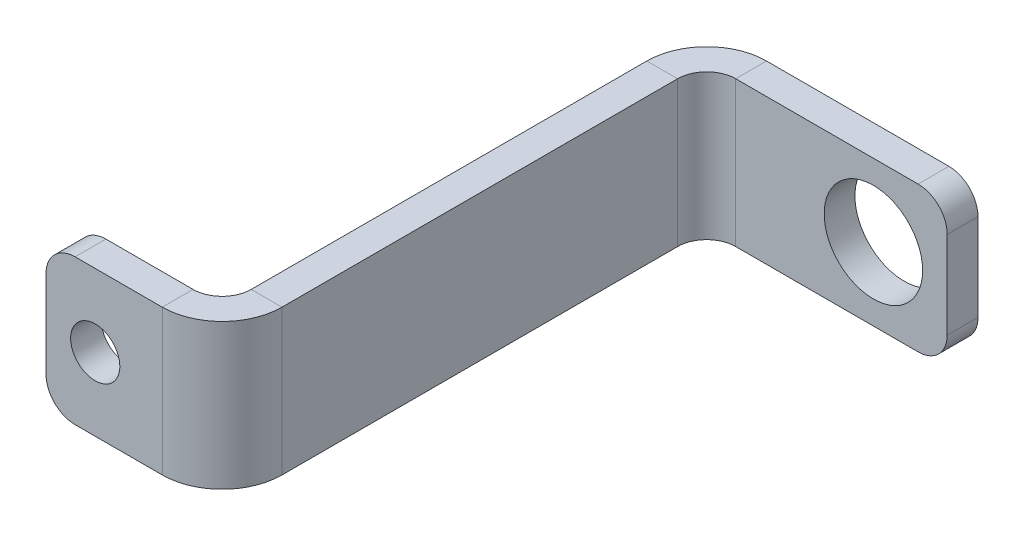
ISO-10303-21;
HEADER;
FILE_DESCRIPTION(('STEP AP214'),'2;1');
FILE_NAME('part.step','',(''),(''),'','','');
FILE_SCHEMA(('AUTOMOTIVE_DESIGN { 1 0 10303 214 1 1 1 1 }'));
ENDSEC;
DATA;
#1=APPLICATION_CONTEXT('core data for automotive mechanical design processes');
#2=APPLICATION_PROTOCOL_DEFINITION('international standard','automotive_design',2000,#1);
#3=PRODUCT_CONTEXT('',#1,'mechanical');
#4=PRODUCT('Part','Part','',(#3));
#5=PRODUCT_RELATED_PRODUCT_CATEGORY('part','',(#4));
#6=PRODUCT_DEFINITION_FORMATION('','',#4);
#7=PRODUCT_DEFINITION_CONTEXT('part definition',#1,'design');
#8=PRODUCT_DEFINITION('design','',#6,#7);
#9=PRODUCT_DEFINITION_SHAPE('','',#8);
#10=(LENGTH_UNIT() NAMED_UNIT(*) SI_UNIT(.MILLI.,.METRE.));
#11=(NAMED_UNIT(*) PLANE_ANGLE_UNIT() SI_UNIT($,.RADIAN.));
#12=(NAMED_UNIT(*) SI_UNIT($,.STERADIAN.) SOLID_ANGLE_UNIT());
#13=UNCERTAINTY_MEASURE_WITH_UNIT(LENGTH_MEASURE(1.E-05),#10,'distance_accuracy_value','');
#14=(GEOMETRIC_REPRESENTATION_CONTEXT(3) GLOBAL_UNCERTAINTY_ASSIGNED_CONTEXT((#13)) GLOBAL_UNIT_ASSIGNED_CONTEXT((#10,
#11,#12)) REPRESENTATION_CONTEXT('',''));
#15=CARTESIAN_POINT('',(0.,0.,0.));
#16=DIRECTION('',(0.,0.,1.));
#17=DIRECTION('',(1.,0.,0.));
#18=AXIS2_PLACEMENT_3D('',#15,#16,#17);
#19=CARTESIAN_POINT('',(10.6750000000002,7.5,-50.));
#20=DIRECTION('',(0.,1.,0.));
#21=DIRECTION('',(0.,0.,1.));
#22=AXIS2_PLACEMENT_3D('',#19,#20,#21);
#23=PLANE('',#22);
#24=DIRECTION('',(0.,0.,-1.));
#25=VECTOR('',#24,1.);
#26=CARTESIAN_POINT('',(10.6750000000002,7.5,-50.));
#27=LINE('',#26,#25);
#28=CARTESIAN_POINT('',(10.675,7.5,-6.17499999999998));
#29=VERTEX_POINT('',#28);
#30=CARTESIAN_POINT('',(10.6750000000001,7.5,-47.));
#31=VERTEX_POINT('',#30);
#32=EDGE_CURVE('E238',#29,#31,#27,.T.);
#33=ORIENTED_EDGE('',*,*,#32,.T.);
#34=DIRECTION('',(-1.,0.,0.));
#35=VECTOR('',#34,1.);
#36=CARTESIAN_POINT('',(10.6750000000001,7.5,-47.));
#37=LINE('',#36,#35);
#38=CARTESIAN_POINT('',(7.50000000000015,7.5,-47.));
#39=VERTEX_POINT('',#38);
#40=EDGE_CURVE('E213',#31,#39,#37,.T.);
#41=ORIENTED_EDGE('',*,*,#40,.T.);
#42=DIRECTION('',(0.,0.,-1.));
#43=VECTOR('',#42,1.);
#44=CARTESIAN_POINT('',(7.50000000000016,7.5,-50.));
#45=LINE('',#44,#43);
#46=CARTESIAN_POINT('',(7.50000000000001,7.5,-6.17499999999999));
#47=VERTEX_POINT('',#46);
#48=EDGE_CURVE('E237',#47,#39,#45,.T.);
#49=ORIENTED_EDGE('',*,*,#48,.F.);
#50=DIRECTION('',(1.,0.,0.));
#51=VECTOR('',#50,1.);
#52=CARTESIAN_POINT('',(7.50000000000001,7.5,-6.17499999999999));
#53=LINE('',#52,#51);
#54=EDGE_CURVE('E224',#47,#29,#53,.T.);
#55=ORIENTED_EDGE('',*,*,#54,.T.);
#56=EDGE_LOOP('',(#33,#41,#49,#55));
#57=FACE_BOUND('',#56,.T.);
#58=ADVANCED_FACE('F43',(#57),#23,.T.);
#59=CARTESIAN_POINT('',(10.675,0.,0.));
#60=DIRECTION('',(1.,0.,0.));
#61=DIRECTION('',(0.,0.,-1.));
#62=AXIS2_PLACEMENT_3D('',#59,#60,#61);
#63=PLANE('',#62);
#64=DIRECTION('',(0.,0.,1.));
#65=VECTOR('',#64,1.);
#66=CARTESIAN_POINT('',(10.675,-7.5,-3.17499999999999));
#67=LINE('',#66,#65);
#68=CARTESIAN_POINT('',(10.6750000000001,-7.5,-47.));
#69=VERTEX_POINT('',#68);
#70=CARTESIAN_POINT('',(10.675,-7.5,-6.17499999999998));
#71=VERTEX_POINT('',#70);
#72=EDGE_CURVE('E241',#69,#71,#67,.T.);
#73=ORIENTED_EDGE('',*,*,#72,.F.);
#74=DIRECTION('',(0.,1.,0.));
#75=VECTOR('',#74,1.);
#76=CARTESIAN_POINT('',(10.6750000000001,7.5,-47.));
#77=LINE('',#76,#75);
#78=EDGE_CURVE('E217',#31,#69,#77,.F.);
#79=ORIENTED_EDGE('',*,*,#78,.F.);
#80=ORIENTED_EDGE('',*,*,#32,.F.);
#81=DIRECTION('',(0.,-1.,0.));
#82=VECTOR('',#81,1.);
#83=CARTESIAN_POINT('',(10.675,0.,-6.17499999999998));
#84=LINE('',#83,#82);
#85=EDGE_CURVE('E232',#29,#71,#84,.T.);
#86=ORIENTED_EDGE('',*,*,#85,.T.);
#87=EDGE_LOOP('',(#73,#79,#80,#86));
#88=FACE_BOUND('',#87,.T.);
#89=ADVANCED_FACE('F341',(#88),#63,.T.);
#90=CARTESIAN_POINT('',(7.49999999999998,0.,0.));
#91=DIRECTION('',(1.,0.,0.));
#92=DIRECTION('',(0.,0.,-1.));
#93=AXIS2_PLACEMENT_3D('',#90,#91,#92);
#94=PLANE('',#93);
#95=DIRECTION('',(0.,1.,0.));
#96=VECTOR('',#95,1.);
#97=CARTESIAN_POINT('',(7.50000000000015,7.5,-47.));
#98=LINE('',#97,#96);
#99=CARTESIAN_POINT('',(7.50000000000015,-7.5,-47.));
#100=VERTEX_POINT('',#99);
#101=EDGE_CURVE('E181',#39,#100,#98,.F.);
#102=ORIENTED_EDGE('',*,*,#101,.T.);
#103=DIRECTION('',(0.,0.,1.));
#104=VECTOR('',#103,1.);
#105=CARTESIAN_POINT('',(7.5,-7.5,-3.175));
#106=LINE('',#105,#104);
#107=CARTESIAN_POINT('',(7.50000000000001,-7.5,-6.17499999999999));
#108=VERTEX_POINT('',#107);
#109=EDGE_CURVE('E242',#100,#108,#106,.T.);
#110=ORIENTED_EDGE('',*,*,#109,.T.);
#111=DIRECTION('',(0.,-1.,0.));
#112=VECTOR('',#111,1.);
#113=CARTESIAN_POINT('',(7.50000000000001,7.5,-6.17499999999999));
#114=LINE('',#113,#112);
#115=EDGE_CURVE('E226',#47,#108,#114,.T.);
#116=ORIENTED_EDGE('',*,*,#115,.F.);
#117=ORIENTED_EDGE('',*,*,#48,.T.);
#118=EDGE_LOOP('',(#102,#110,#116,#117));
#119=FACE_BOUND('',#118,.T.);
#120=ADVANCED_FACE('F349',(#119),#94,.F.);
#121=CARTESIAN_POINT('',(-7.5,-7.5,-3.175));
#122=DIRECTION('',(0.,-1.,0.));
#123=DIRECTION('',(0.,0.,-1.));
#124=AXIS2_PLACEMENT_3D('',#121,#122,#123);
#125=PLANE('',#124);
#126=DIRECTION('',(1.,0.,0.));
#127=VECTOR('',#126,1.);
#128=CARTESIAN_POINT('',(-7.5,-7.5,0.));
#129=LINE('',#128,#127);
#130=CARTESIAN_POINT('',(-4.5,-7.5,0.));
#131=VERTEX_POINT('',#130);
#132=CARTESIAN_POINT('',(4.50000000000001,-7.5,0.));
#133=VERTEX_POINT('',#132);
#134=EDGE_CURVE('E274',#131,#133,#129,.T.);
#135=ORIENTED_EDGE('',*,*,#134,.F.);
#136=DIRECTION('',(0.,0.,1.));
#137=VECTOR('',#136,1.);
#138=CARTESIAN_POINT('',(-4.5,-7.5,-3.175));
#139=LINE('',#138,#137);
#140=CARTESIAN_POINT('',(-4.5,-7.5,-3.175));
#141=VERTEX_POINT('',#140);
#142=EDGE_CURVE('E66',#131,#141,#139,.F.);
#143=ORIENTED_EDGE('',*,*,#142,.T.);
#144=DIRECTION('',(1.,0.,0.));
#145=VECTOR('',#144,1.);
#146=CARTESIAN_POINT('',(-7.5,-7.5,-3.175));
#147=LINE('',#146,#145);
#148=CARTESIAN_POINT('',(4.50000000000001,-7.5,-3.175));
#149=VERTEX_POINT('',#148);
#150=EDGE_CURVE('E277',#141,#149,#147,.T.);
#151=ORIENTED_EDGE('',*,*,#150,.T.);
#152=DIRECTION('',(0.,0.,1.));
#153=VECTOR('',#152,1.);
#154=CARTESIAN_POINT('',(4.50000000000001,-7.5,-3.175));
#155=LINE('',#154,#153);
#156=EDGE_CURVE('E254',#149,#133,#155,.T.);
#157=ORIENTED_EDGE('',*,*,#156,.T.);
#158=EDGE_LOOP('',(#135,#143,#151,#157));
#159=FACE_BOUND('',#158,.T.);
#160=ADVANCED_FACE('F324',(#159),#125,.T.);
#161=CARTESIAN_POINT('',(0.,0.,-3.175));
#162=DIRECTION('',(0.,0.,-1.));
#163=DIRECTION('',(-1.,0.,0.));
#164=AXIS2_PLACEMENT_3D('',#161,#162,#163);
#165=PLANE('',#164);
#166=CARTESIAN_POINT('',(-2.42000000000001,0.,-3.175));
#167=DIRECTION('',(0.,0.,-1.));
#168=DIRECTION('',(-1.,0.,0.));
#169=AXIS2_PLACEMENT_3D('',#166,#167,#168);
#170=CIRCLE('',#169,2.54);
#171=CARTESIAN_POINT('',(-4.96000000000001,0.,-3.175));
#172=VERTEX_POINT('',#171);
#173=EDGE_CURVE('E413',#172,#172,#170,.T.);
#174=ORIENTED_EDGE('',*,*,#173,.F.);
#175=EDGE_LOOP('',(#174));
#176=FACE_BOUND('',#175,.T.);
#177=ORIENTED_EDGE('',*,*,#150,.F.);
#178=CARTESIAN_POINT('',(-4.5,-4.5,-3.175));
#179=DIRECTION('',(0.,0.,-1.));
#180=DIRECTION('',(-1.,0.,0.));
#181=AXIS2_PLACEMENT_3D('',#178,#179,#180);
#182=CIRCLE('',#181,3.);
#183=CARTESIAN_POINT('',(-7.5,-4.5,-3.175));
#184=VERTEX_POINT('',#183);
#185=EDGE_CURVE('E51',#141,#184,#182,.T.);
#186=ORIENTED_EDGE('',*,*,#185,.T.);
#187=DIRECTION('',(0.,-1.,0.));
#188=VECTOR('',#187,1.);
#189=CARTESIAN_POINT('',(-7.5,-7.5,-3.175));
#190=LINE('',#189,#188);
#191=CARTESIAN_POINT('',(-7.5,4.5,-3.175));
#192=VERTEX_POINT('',#191);
#193=EDGE_CURVE('E273',#192,#184,#190,.T.);
#194=ORIENTED_EDGE('',*,*,#193,.F.);
#195=CARTESIAN_POINT('',(-4.5,4.5,-3.175));
#196=DIRECTION('',(0.,0.,-1.));
#197=DIRECTION('',(-1.,0.,0.));
#198=AXIS2_PLACEMENT_3D('',#195,#196,#197);
#199=CIRCLE('',#198,3.);
#200=CARTESIAN_POINT('',(-4.5,7.5,-3.175));
#201=VERTEX_POINT('',#200);
#202=EDGE_CURVE('E58',#192,#201,#199,.T.);
#203=ORIENTED_EDGE('',*,*,#202,.T.);
#204=DIRECTION('',(-1.,0.,0.));
#205=VECTOR('',#204,1.);
#206=CARTESIAN_POINT('',(-7.5,7.5,-3.175));
#207=LINE('',#206,#205);
#208=CARTESIAN_POINT('',(4.50000000000001,7.5,-3.175));
#209=VERTEX_POINT('',#208);
#210=EDGE_CURVE('E271',#209,#201,#207,.T.);
#211=ORIENTED_EDGE('',*,*,#210,.F.);
#212=DIRECTION('',(0.,-1.,0.));
#213=VECTOR('',#212,1.);
#214=CARTESIAN_POINT('',(4.50000000000001,-7.5,-3.175));
#215=LINE('',#214,#213);
#216=EDGE_CURVE('E260',#149,#209,#215,.F.);
#217=ORIENTED_EDGE('',*,*,#216,.F.);
#218=EDGE_LOOP('',(#177,#186,#194,#203,#211,#217));
#219=FACE_BOUND('',#218,.T.);
#220=ADVANCED_FACE('F313',(#176,#219),#165,.T.);
#221=CARTESIAN_POINT('',(0.,0.,0.));
#222=DIRECTION('',(0.,0.,-1.));
#223=DIRECTION('',(-1.,0.,0.));
#224=AXIS2_PLACEMENT_3D('',#221,#222,#223);
#225=PLANE('',#224);
#226=CARTESIAN_POINT('',(-2.42000000000001,0.,0.));
#227=DIRECTION('',(0.,0.,1.));
#228=DIRECTION('',(1.,0.,0.));
#229=AXIS2_PLACEMENT_3D('',#226,#227,#228);
#230=CIRCLE('',#229,2.54);
#231=CARTESIAN_POINT('',(0.119999999999994,0.,0.));
#232=VERTEX_POINT('',#231);
#233=EDGE_CURVE('E417',#232,#232,#230,.T.);
#234=ORIENTED_EDGE('',*,*,#233,.F.);
#235=EDGE_LOOP('',(#234));
#236=FACE_BOUND('',#235,.T.);
#237=DIRECTION('',(0.,-1.,0.));
#238=VECTOR('',#237,1.);
#239=CARTESIAN_POINT('',(-7.5,-7.5,0.));
#240=LINE('',#239,#238);
#241=CARTESIAN_POINT('',(-7.5,4.5,0.));
#242=VERTEX_POINT('',#241);
#243=CARTESIAN_POINT('',(-7.5,-4.5,0.));
#244=VERTEX_POINT('',#243);
#245=EDGE_CURVE('E282',#242,#244,#240,.T.);
#246=ORIENTED_EDGE('',*,*,#245,.T.);
#247=CARTESIAN_POINT('',(-4.5,-4.5,0.));
#248=DIRECTION('',(0.,0.,-1.));
#249=DIRECTION('',(-1.,0.,0.));
#250=AXIS2_PLACEMENT_3D('',#247,#248,#249);
#251=CIRCLE('',#250,3.);
#252=EDGE_CURVE('E309',#244,#131,#251,.F.);
#253=ORIENTED_EDGE('',*,*,#252,.T.);
#254=ORIENTED_EDGE('',*,*,#134,.T.);
#255=DIRECTION('',(0.,-1.,0.));
#256=VECTOR('',#255,1.);
#257=CARTESIAN_POINT('',(4.50000000000001,-7.5,0.));
#258=LINE('',#257,#256);
#259=CARTESIAN_POINT('',(4.50000000000001,7.5,0.));
#260=VERTEX_POINT('',#259);
#261=EDGE_CURVE('E248',#133,#260,#258,.F.);
#262=ORIENTED_EDGE('',*,*,#261,.T.);
#263=DIRECTION('',(-1.,0.,0.));
#264=VECTOR('',#263,1.);
#265=CARTESIAN_POINT('',(-7.5,7.5,0.));
#266=LINE('',#265,#264);
#267=CARTESIAN_POINT('',(-4.5,7.5,0.));
#268=VERTEX_POINT('',#267);
#269=EDGE_CURVE('E268',#260,#268,#266,.T.);
#270=ORIENTED_EDGE('',*,*,#269,.T.);
#271=CARTESIAN_POINT('',(-4.5,4.5,0.));
#272=DIRECTION('',(0.,0.,-1.));
#273=DIRECTION('',(-1.,0.,0.));
#274=AXIS2_PLACEMENT_3D('',#271,#272,#273);
#275=CIRCLE('',#274,3.);
#276=EDGE_CURVE('E307',#268,#242,#275,.F.);
#277=ORIENTED_EDGE('',*,*,#276,.T.);
#278=EDGE_LOOP('',(#246,#253,#254,#262,#270,#277));
#279=FACE_BOUND('',#278,.T.);
#280=ADVANCED_FACE('F323',(#236,#279),#225,.F.);
#281=CARTESIAN_POINT('',(-7.5,-7.5,-3.175));
#282=DIRECTION('',(-1.,0.,0.));
#283=DIRECTION('',(0.,0.,1.));
#284=AXIS2_PLACEMENT_3D('',#281,#282,#283);
#285=PLANE('',#284);
#286=ORIENTED_EDGE('',*,*,#193,.T.);
#287=DIRECTION('',(0.,0.,1.));
#288=VECTOR('',#287,1.);
#289=CARTESIAN_POINT('',(-7.5,-4.5,-3.175));
#290=LINE('',#289,#288);
#291=EDGE_CURVE('E304',#184,#244,#290,.T.);
#292=ORIENTED_EDGE('',*,*,#291,.T.);
#293=ORIENTED_EDGE('',*,*,#245,.F.);
#294=DIRECTION('',(0.,0.,1.));
#295=VECTOR('',#294,1.);
#296=CARTESIAN_POINT('',(-7.5,4.5,-3.175));
#297=LINE('',#296,#295);
#298=EDGE_CURVE('E302',#242,#192,#297,.F.);
#299=ORIENTED_EDGE('',*,*,#298,.T.);
#300=EDGE_LOOP('',(#286,#292,#293,#299));
#301=FACE_BOUND('',#300,.T.);
#302=ADVANCED_FACE('F318',(#301),#285,.T.);
#303=CARTESIAN_POINT('',(-7.5,7.5,-3.175));
#304=DIRECTION('',(0.,1.,0.));
#305=DIRECTION('',(0.,0.,1.));
#306=AXIS2_PLACEMENT_3D('',#303,#304,#305);
#307=PLANE('',#306);
#308=ORIENTED_EDGE('',*,*,#210,.T.);
#309=DIRECTION('',(0.,0.,1.));
#310=VECTOR('',#309,1.);
#311=CARTESIAN_POINT('',(-4.5,7.5,-3.175));
#312=LINE('',#311,#310);
#313=EDGE_CURVE('E11',#201,#268,#312,.T.);
#314=ORIENTED_EDGE('',*,*,#313,.T.);
#315=ORIENTED_EDGE('',*,*,#269,.F.);
#316=DIRECTION('',(0.,0.,1.));
#317=VECTOR('',#316,1.);
#318=CARTESIAN_POINT('',(4.50000000000001,7.5,-3.175));
#319=LINE('',#318,#317);
#320=EDGE_CURVE('E265',#209,#260,#319,.T.);
#321=ORIENTED_EDGE('',*,*,#320,.F.);
#322=EDGE_LOOP('',(#308,#314,#315,#321));
#323=FACE_BOUND('',#322,.T.);
#324=ADVANCED_FACE('F354',(#323),#307,.T.);
#325=CARTESIAN_POINT('',(4.50000000000001,7.5,-6.175));
#326=DIRECTION('',(0.,1.,0.));
#327=DIRECTION('',(0.,0.,1.));
#328=AXIS2_PLACEMENT_3D('',#325,#326,#327);
#329=PLANE('',#328);
#330=ORIENTED_EDGE('',*,*,#54,.F.);
#331=CARTESIAN_POINT('',(4.50000000000001,7.5,-6.175));
#332=DIRECTION('',(0.,-1.,0.));
#333=DIRECTION('',(0.,0.,-1.));
#334=AXIS2_PLACEMENT_3D('',#331,#332,#333);
#335=CIRCLE('',#334,3.);
#336=EDGE_CURVE('E257',#209,#47,#335,.F.);
#337=ORIENTED_EDGE('',*,*,#336,.F.);
#338=ORIENTED_EDGE('',*,*,#320,.T.);
#339=CARTESIAN_POINT('',(4.50000000000001,7.5,-6.175));
#340=DIRECTION('',(0.,-1.,0.));
#341=DIRECTION('',(0.,0.,-1.));
#342=AXIS2_PLACEMENT_3D('',#339,#340,#341);
#343=CIRCLE('',#342,6.175);
#344=EDGE_CURVE('E250',#260,#29,#343,.F.);
#345=ORIENTED_EDGE('',*,*,#344,.T.);
#346=EDGE_LOOP('',(#330,#337,#338,#345));
#347=FACE_BOUND('',#346,.T.);
#348=ADVANCED_FACE('F343',(#347),#329,.T.);
#349=CARTESIAN_POINT('',(4.50000000000001,-7.5,-6.175));
#350=DIRECTION('',(0.,1.,0.));
#351=DIRECTION('',(0.,0.,1.));
#352=AXIS2_PLACEMENT_3D('',#349,#350,#351);
#353=PLANE('',#352);
#354=CARTESIAN_POINT('',(4.50000000000001,-7.5,-6.175));
#355=DIRECTION('',(0.,-1.,0.));
#356=DIRECTION('',(0.,0.,-1.));
#357=AXIS2_PLACEMENT_3D('',#354,#355,#356);
#358=CIRCLE('',#357,3.);
#359=EDGE_CURVE('E244',#108,#149,#358,.T.);
#360=ORIENTED_EDGE('',*,*,#359,.F.);
#361=DIRECTION('',(1.,0.,0.));
#362=VECTOR('',#361,1.);
#363=CARTESIAN_POINT('',(7.50000000000001,-7.5,-6.17499999999999));
#364=LINE('',#363,#362);
#365=EDGE_CURVE('E229',#108,#71,#364,.T.);
#366=ORIENTED_EDGE('',*,*,#365,.T.);
#367=CARTESIAN_POINT('',(4.50000000000001,-7.5,-6.175));
#368=DIRECTION('',(0.,-1.,0.));
#369=DIRECTION('',(0.,0.,-1.));
#370=AXIS2_PLACEMENT_3D('',#367,#368,#369);
#371=CIRCLE('',#370,6.175);
#372=EDGE_CURVE('E251',#71,#133,#371,.T.);
#373=ORIENTED_EDGE('',*,*,#372,.T.);
#374=ORIENTED_EDGE('',*,*,#156,.F.);
#375=EDGE_LOOP('',(#360,#366,#373,#374));
#376=FACE_BOUND('',#375,.T.);
#377=ADVANCED_FACE('F334',(#376),#353,.F.);
#378=CARTESIAN_POINT('',(4.50000000000001,-7.5,-6.175));
#379=DIRECTION('',(0.,-1.,0.));
#380=DIRECTION('',(1.,0.,0.));
#381=AXIS2_PLACEMENT_3D('',#378,#379,#380);
#382=CYLINDRICAL_SURFACE('',#381,6.175);
#383=ORIENTED_EDGE('',*,*,#261,.F.);
#384=ORIENTED_EDGE('',*,*,#372,.F.);
#385=ORIENTED_EDGE('',*,*,#85,.F.);
#386=ORIENTED_EDGE('',*,*,#344,.F.);
#387=EDGE_LOOP('',(#383,#384,#385,#386));
#388=FACE_BOUND('',#387,.T.);
#389=ADVANCED_FACE('F332',(#388),#382,.T.);
#390=CARTESIAN_POINT('',(4.50000000000001,-7.5,-6.175));
#391=DIRECTION('',(0.,-1.,0.));
#392=DIRECTION('',(1.,0.,0.));
#393=AXIS2_PLACEMENT_3D('',#390,#391,#392);
#394=CYLINDRICAL_SURFACE('',#393,3.);
#395=ORIENTED_EDGE('',*,*,#216,.T.);
#396=ORIENTED_EDGE('',*,*,#336,.T.);
#397=ORIENTED_EDGE('',*,*,#115,.T.);
#398=ORIENTED_EDGE('',*,*,#359,.T.);
#399=EDGE_LOOP('',(#395,#396,#397,#398));
#400=FACE_BOUND('',#399,.T.);
#401=ADVANCED_FACE('F351',(#400),#394,.F.);
#402=CARTESIAN_POINT('',(10.675,-7.5,-3.17499999999999));
#403=DIRECTION('',(0.,-1.,0.));
#404=DIRECTION('',(0.,0.,-1.));
#405=AXIS2_PLACEMENT_3D('',#402,#403,#404);
#406=PLANE('',#405);
#407=DIRECTION('',(-1.,0.,0.));
#408=VECTOR('',#407,1.);
#409=CARTESIAN_POINT('',(10.6750000000001,-7.5,-47.));
#410=LINE('',#409,#408);
#411=EDGE_CURVE('E221',#69,#100,#410,.T.);
#412=ORIENTED_EDGE('',*,*,#411,.F.);
#413=ORIENTED_EDGE('',*,*,#72,.T.);
#414=ORIENTED_EDGE('',*,*,#365,.F.);
#415=ORIENTED_EDGE('',*,*,#109,.F.);
#416=EDGE_LOOP('',(#412,#413,#414,#415));
#417=FACE_BOUND('',#416,.T.);
#418=ADVANCED_FACE('F369',(#417),#406,.T.);
#419=CARTESIAN_POINT('',(13.6750000000001,-7.5,-47.));
#420=DIRECTION('',(0.,-1.,0.));
#421=DIRECTION('',(0.,0.,-1.));
#422=AXIS2_PLACEMENT_3D('',#419,#420,#421);
#423=PLANE('',#422);
#424=DIRECTION('',(0.,0.,-1.));
#425=VECTOR('',#424,1.);
#426=CARTESIAN_POINT('',(13.6750000000001,-7.5,-50.));
#427=LINE('',#426,#425);
#428=CARTESIAN_POINT('',(13.6750000000001,-7.5,-50.));
#429=VERTEX_POINT('',#428);
#430=CARTESIAN_POINT('',(13.6750000000001,-7.5,-53.175));
#431=VERTEX_POINT('',#430);
#432=EDGE_CURVE('E203',#429,#431,#427,.T.);
#433=ORIENTED_EDGE('',*,*,#432,.F.);
#434=CARTESIAN_POINT('',(13.6750000000001,-7.5,-47.));
#435=DIRECTION('',(0.,1.,0.));
#436=DIRECTION('',(0.,0.,1.));
#437=AXIS2_PLACEMENT_3D('',#434,#435,#436);
#438=CIRCLE('',#437,3.);
#439=EDGE_CURVE('E184',#69,#429,#438,.F.);
#440=ORIENTED_EDGE('',*,*,#439,.F.);
#441=ORIENTED_EDGE('',*,*,#411,.T.);
#442=CARTESIAN_POINT('',(13.6750000000001,-7.5,-47.));
#443=DIRECTION('',(0.,1.,0.));
#444=DIRECTION('',(0.,0.,1.));
#445=AXIS2_PLACEMENT_3D('',#442,#443,#444);
#446=CIRCLE('',#445,6.175);
#447=EDGE_CURVE('E212',#100,#431,#446,.F.);
#448=ORIENTED_EDGE('',*,*,#447,.T.);
#449=EDGE_LOOP('',(#433,#440,#441,#448));
#450=FACE_BOUND('',#449,.T.);
#451=ADVANCED_FACE('F445',(#450),#423,.T.);
#452=CARTESIAN_POINT('',(13.6750000000001,7.5,-47.));
#453=DIRECTION('',(0.,-1.,0.));
#454=DIRECTION('',(0.,0.,-1.));
#455=AXIS2_PLACEMENT_3D('',#452,#453,#454);
#456=PLANE('',#455);
#457=CARTESIAN_POINT('',(13.6750000000001,7.5,-47.));
#458=DIRECTION('',(0.,1.,0.));
#459=DIRECTION('',(0.,0.,1.));
#460=AXIS2_PLACEMENT_3D('',#457,#458,#459);
#461=CIRCLE('',#460,3.);
#462=CARTESIAN_POINT('',(13.6750000000001,7.5,-50.));
#463=VERTEX_POINT('',#462);
#464=EDGE_CURVE('E170',#463,#31,#461,.T.);
#465=ORIENTED_EDGE('',*,*,#464,.F.);
#466=DIRECTION('',(0.,0.,-1.));
#467=VECTOR('',#466,1.);
#468=CARTESIAN_POINT('',(13.6750000000001,7.5,-50.));
#469=LINE('',#468,#467);
#470=CARTESIAN_POINT('',(13.6750000000001,7.5,-53.175));
#471=VERTEX_POINT('',#470);
#472=EDGE_CURVE('E164',#463,#471,#469,.T.);
#473=ORIENTED_EDGE('',*,*,#472,.T.);
#474=CARTESIAN_POINT('',(13.6750000000001,7.5,-47.));
#475=DIRECTION('',(0.,1.,0.));
#476=DIRECTION('',(0.,0.,1.));
#477=AXIS2_PLACEMENT_3D('',#474,#475,#476);
#478=CIRCLE('',#477,6.175);
#479=EDGE_CURVE('E176',#471,#39,#478,.T.);
#480=ORIENTED_EDGE('',*,*,#479,.T.);
#481=ORIENTED_EDGE('',*,*,#40,.F.);
#482=EDGE_LOOP('',(#465,#473,#480,#481));
#483=FACE_BOUND('',#482,.T.);
#484=ADVANCED_FACE('F187',(#483),#456,.F.);
#485=CARTESIAN_POINT('',(13.6750000000001,7.5,-47.));
#486=DIRECTION('',(0.,1.,0.));
#487=DIRECTION('',(0.,0.,-1.));
#488=AXIS2_PLACEMENT_3D('',#485,#486,#487);
#489=CYLINDRICAL_SURFACE('',#488,6.175);
#490=ORIENTED_EDGE('',*,*,#101,.F.);
#491=ORIENTED_EDGE('',*,*,#479,.F.);
#492=DIRECTION('',(0.,1.,0.));
#493=VECTOR('',#492,1.);
#494=CARTESIAN_POINT('',(13.6750000000001,0.,-53.175));
#495=LINE('',#494,#493);
#496=EDGE_CURVE('E179',#431,#471,#495,.T.);
#497=ORIENTED_EDGE('',*,*,#496,.F.);
#498=ORIENTED_EDGE('',*,*,#447,.F.);
#499=EDGE_LOOP('',(#490,#491,#497,#498));
#500=FACE_BOUND('',#499,.T.);
#501=ADVANCED_FACE('F177',(#500),#489,.T.);
#502=CARTESIAN_POINT('',(13.6750000000001,7.5,-47.));
#503=DIRECTION('',(0.,1.,0.));
#504=DIRECTION('',(0.,0.,-1.));
#505=AXIS2_PLACEMENT_3D('',#502,#503,#504);
#506=CYLINDRICAL_SURFACE('',#505,3.);
#507=ORIENTED_EDGE('',*,*,#78,.T.);
#508=ORIENTED_EDGE('',*,*,#439,.T.);
#509=DIRECTION('',(0.,1.,0.));
#510=VECTOR('',#509,1.);
#511=CARTESIAN_POINT('',(13.6750000000001,-7.5,-50.));
#512=LINE('',#511,#510);
#513=EDGE_CURVE('E189',#429,#463,#512,.T.);
#514=ORIENTED_EDGE('',*,*,#513,.T.);
#515=ORIENTED_EDGE('',*,*,#464,.T.);
#516=EDGE_LOOP('',(#507,#508,#514,#515));
#517=FACE_BOUND('',#516,.T.);
#518=ADVANCED_FACE('F444',(#517),#506,.F.);
#519=CARTESIAN_POINT('',(10.6750000000002,7.5,-53.175));
#520=DIRECTION('',(0.,1.,0.));
#521=DIRECTION('',(0.,0.,1.));
#522=AXIS2_PLACEMENT_3D('',#519,#520,#521);
#523=PLANE('',#522);
#524=DIRECTION('',(-1.,0.,0.));
#525=VECTOR('',#524,1.);
#526=CARTESIAN_POINT('',(10.6750000000002,7.5,-50.));
#527=LINE('',#526,#525);
#528=CARTESIAN_POINT('',(32.5000000000002,7.5,-50.));
#529=VERTEX_POINT('',#528);
#530=EDGE_CURVE('E205',#529,#463,#527,.T.);
#531=ORIENTED_EDGE('',*,*,#530,.F.);
#532=DIRECTION('',(0.,0.,1.));
#533=VECTOR('',#532,1.);
#534=CARTESIAN_POINT('',(32.5000000000002,7.5,-53.175));
#535=LINE('',#534,#533);
#536=CARTESIAN_POINT('',(32.5000000000002,7.5,-53.175));
#537=VERTEX_POINT('',#536);
#538=EDGE_CURVE('E166',#529,#537,#535,.F.);
#539=ORIENTED_EDGE('',*,*,#538,.T.);
#540=DIRECTION('',(-1.,0.,0.));
#541=VECTOR('',#540,1.);
#542=CARTESIAN_POINT('',(10.6750000000002,7.5,-53.175));
#543=LINE('',#542,#541);
#544=EDGE_CURVE('E159',#537,#471,#543,.T.);
#545=ORIENTED_EDGE('',*,*,#544,.T.);
#546=ORIENTED_EDGE('',*,*,#472,.F.);
#547=EDGE_LOOP('',(#531,#539,#545,#546));
#548=FACE_BOUND('',#547,.T.);
#549=ADVANCED_FACE('F162',(#548),#523,.T.);
#550=CARTESIAN_POINT('',(35.5000000000002,-7.5,-53.175));
#551=DIRECTION('',(0.,-1.,0.));
#552=DIRECTION('',(0.,0.,-1.));
#553=AXIS2_PLACEMENT_3D('',#550,#551,#552);
#554=PLANE('',#553);
#555=DIRECTION('',(1.,0.,0.));
#556=VECTOR('',#555,1.);
#557=CARTESIAN_POINT('',(35.5000000000002,-7.5,-53.175));
#558=LINE('',#557,#556);
#559=CARTESIAN_POINT('',(32.5000000000002,-7.5,-53.175));
#560=VERTEX_POINT('',#559);
#561=EDGE_CURVE('E195',#431,#560,#558,.T.);
#562=ORIENTED_EDGE('',*,*,#561,.T.);
#563=DIRECTION('',(0.,0.,1.));
#564=VECTOR('',#563,1.);
#565=CARTESIAN_POINT('',(32.5000000000002,-7.5,-53.175));
#566=LINE('',#565,#564);
#567=CARTESIAN_POINT('',(32.5000000000002,-7.5,-50.));
#568=VERTEX_POINT('',#567);
#569=EDGE_CURVE('E279',#560,#568,#566,.T.);
#570=ORIENTED_EDGE('',*,*,#569,.T.);
#571=DIRECTION('',(1.,0.,0.));
#572=VECTOR('',#571,1.);
#573=CARTESIAN_POINT('',(35.5000000000002,-7.5,-50.));
#574=LINE('',#573,#572);
#575=EDGE_CURVE('E196',#429,#568,#574,.T.);
#576=ORIENTED_EDGE('',*,*,#575,.F.);
#577=ORIENTED_EDGE('',*,*,#432,.T.);
#578=EDGE_LOOP('',(#562,#570,#576,#577));
#579=FACE_BOUND('',#578,.T.);
#580=ADVANCED_FACE('F409',(#579),#554,.T.);
#581=CARTESIAN_POINT('',(0.,0.,-53.175));
#582=DIRECTION('',(0.,0.,-1.));
#583=DIRECTION('',(-1.,0.,0.));
#584=AXIS2_PLACEMENT_3D('',#581,#582,#583);
#585=PLANE('',#584);
#586=CARTESIAN_POINT('',(27.8800000000002,0.,-53.175));
#587=DIRECTION('',(0.,0.,1.));
#588=DIRECTION('',(1.,0.,0.));
#589=AXIS2_PLACEMENT_3D('',#586,#587,#588);
#590=CIRCLE('',#589,5.08);
#591=CARTESIAN_POINT('',(32.9600000000002,0.,-53.175));
#592=VERTEX_POINT('',#591);
#593=EDGE_CURVE('E422',#592,#592,#590,.T.);
#594=ORIENTED_EDGE('',*,*,#593,.T.);
#595=EDGE_LOOP('',(#594));
#596=FACE_BOUND('',#595,.T.);
#597=DIRECTION('',(0.,1.,0.));
#598=VECTOR('',#597,1.);
#599=CARTESIAN_POINT('',(35.5000000000002,7.5,-53.175));
#600=LINE('',#599,#598);
#601=CARTESIAN_POINT('',(35.5000000000002,-4.5,-53.175));
#602=VERTEX_POINT('',#601);
#603=CARTESIAN_POINT('',(35.5000000000002,4.5,-53.175));
#604=VERTEX_POINT('',#603);
#605=EDGE_CURVE('E171',#602,#604,#600,.T.);
#606=ORIENTED_EDGE('',*,*,#605,.F.);
#607=CARTESIAN_POINT('',(32.5000000000002,-4.5,-53.175));
#608=DIRECTION('',(0.,0.,-1.));
#609=DIRECTION('',(-1.,0.,0.));
#610=AXIS2_PLACEMENT_3D('',#607,#608,#609);
#611=CIRCLE('',#610,3.);
#612=EDGE_CURVE('E299',#602,#560,#611,.T.);
#613=ORIENTED_EDGE('',*,*,#612,.T.);
#614=ORIENTED_EDGE('',*,*,#561,.F.);
#615=ORIENTED_EDGE('',*,*,#496,.T.);
#616=ORIENTED_EDGE('',*,*,#544,.F.);
#617=CARTESIAN_POINT('',(32.5000000000002,4.5,-53.175));
#618=DIRECTION('',(0.,0.,-1.));
#619=DIRECTION('',(-1.,0.,0.));
#620=AXIS2_PLACEMENT_3D('',#617,#618,#619);
#621=CIRCLE('',#620,3.);
#622=EDGE_CURVE('E297',#537,#604,#621,.T.);
#623=ORIENTED_EDGE('',*,*,#622,.T.);
#624=EDGE_LOOP('',(#606,#613,#614,#615,#616,#623));
#625=FACE_BOUND('',#624,.T.);
#626=ADVANCED_FACE('F193',(#596,#625),#585,.T.);
#627=CARTESIAN_POINT('',(0.,0.,-50.));
#628=DIRECTION('',(0.,0.,-1.));
#629=DIRECTION('',(-1.,0.,0.));
#630=AXIS2_PLACEMENT_3D('',#627,#628,#629);
#631=PLANE('',#630);
#632=CARTESIAN_POINT('',(27.8800000000002,0.,-50.));
#633=DIRECTION('',(0.,0.,1.));
#634=DIRECTION('',(1.,0.,0.));
#635=AXIS2_PLACEMENT_3D('',#632,#633,#634);
#636=CIRCLE('',#635,5.08);
#637=CARTESIAN_POINT('',(32.9600000000002,0.,-50.));
#638=VERTEX_POINT('',#637);
#639=EDGE_CURVE('E425',#638,#638,#636,.T.);
#640=ORIENTED_EDGE('',*,*,#639,.F.);
#641=EDGE_LOOP('',(#640));
#642=FACE_BOUND('',#641,.T.);
#643=ORIENTED_EDGE('',*,*,#575,.T.);
#644=CARTESIAN_POINT('',(32.5000000000002,-4.5,-50.));
#645=DIRECTION('',(0.,0.,-1.));
#646=DIRECTION('',(-1.,0.,0.));
#647=AXIS2_PLACEMENT_3D('',#644,#645,#646);
#648=CIRCLE('',#647,3.);
#649=CARTESIAN_POINT('',(35.5000000000002,-4.5,-50.));
#650=VERTEX_POINT('',#649);
#651=EDGE_CURVE('E290',#568,#650,#648,.F.);
#652=ORIENTED_EDGE('',*,*,#651,.T.);
#653=DIRECTION('',(0.,1.,0.));
#654=VECTOR('',#653,1.);
#655=CARTESIAN_POINT('',(35.5000000000002,7.5,-50.));
#656=LINE('',#655,#654);
#657=CARTESIAN_POINT('',(35.5000000000002,4.5,-50.));
#658=VERTEX_POINT('',#657);
#659=EDGE_CURVE('E199',#650,#658,#656,.T.);
#660=ORIENTED_EDGE('',*,*,#659,.T.);
#661=CARTESIAN_POINT('',(32.5000000000002,4.5,-50.));
#662=DIRECTION('',(0.,0.,-1.));
#663=DIRECTION('',(-1.,0.,0.));
#664=AXIS2_PLACEMENT_3D('',#661,#662,#663);
#665=CIRCLE('',#664,3.);
#666=EDGE_CURVE('E288',#658,#529,#665,.F.);
#667=ORIENTED_EDGE('',*,*,#666,.T.);
#668=ORIENTED_EDGE('',*,*,#530,.T.);
#669=ORIENTED_EDGE('',*,*,#513,.F.);
#670=EDGE_LOOP('',(#643,#652,#660,#667,#668,#669));
#671=FACE_BOUND('',#670,.T.);
#672=ADVANCED_FACE('F438',(#642,#671),#631,.F.);
#673=CARTESIAN_POINT('',(35.5000000000002,7.5,-53.175));
#674=DIRECTION('',(1.,0.,0.));
#675=DIRECTION('',(0.,0.,-1.));
#676=AXIS2_PLACEMENT_3D('',#673,#674,#675);
#677=PLANE('',#676);
#678=ORIENTED_EDGE('',*,*,#659,.F.);
#679=DIRECTION('',(0.,0.,1.));
#680=VECTOR('',#679,1.);
#681=CARTESIAN_POINT('',(35.5000000000002,-4.5,-53.175));
#682=LINE('',#681,#680);
#683=EDGE_CURVE('E295',#650,#602,#682,.F.);
#684=ORIENTED_EDGE('',*,*,#683,.T.);
#685=ORIENTED_EDGE('',*,*,#605,.T.);
#686=DIRECTION('',(0.,0.,1.));
#687=VECTOR('',#686,1.);
#688=CARTESIAN_POINT('',(35.5000000000002,4.5,-53.175));
#689=LINE('',#688,#687);
#690=EDGE_CURVE('E292',#604,#658,#689,.T.);
#691=ORIENTED_EDGE('',*,*,#690,.T.);
#692=EDGE_LOOP('',(#678,#684,#685,#691));
#693=FACE_BOUND('',#692,.T.);
#694=ADVANCED_FACE('F404',(#693),#677,.T.);
#695=CARTESIAN_POINT('',(-2.42000000000001,0.,-53.175));
#696=DIRECTION('',(0.,0.,1.));
#697=DIRECTION('',(1.,0.,0.));
#698=AXIS2_PLACEMENT_3D('',#695,#696,#697);
#699=CYLINDRICAL_SURFACE('',#698,2.54);
#700=ORIENTED_EDGE('',*,*,#173,.T.);
#701=EDGE_LOOP('',(#700));
#702=FACE_BOUND('',#701,.T.);
#703=ORIENTED_EDGE('',*,*,#233,.T.);
#704=EDGE_LOOP('',(#703));
#705=FACE_BOUND('',#704,.T.);
#706=ADVANCED_FACE('F434',(#702,#705),#699,.F.);
#707=CARTESIAN_POINT('',(27.8800000000002,0.,-53.175));
#708=DIRECTION('',(0.,0.,1.));
#709=DIRECTION('',(1.,0.,0.));
#710=AXIS2_PLACEMENT_3D('',#707,#708,#709);
#711=CYLINDRICAL_SURFACE('',#710,5.08);
#712=ORIENTED_EDGE('',*,*,#593,.F.);
#713=EDGE_LOOP('',(#712));
#714=FACE_BOUND('',#713,.T.);
#715=ORIENTED_EDGE('',*,*,#639,.T.);
#716=EDGE_LOOP('',(#715));
#717=FACE_BOUND('',#716,.T.);
#718=ADVANCED_FACE('F394',(#714,#717),#711,.F.);
#719=CARTESIAN_POINT('',(32.5000000000002,-4.5,-53.175));
#720=DIRECTION('',(0.,0.,1.));
#721=DIRECTION('',(1.,0.,0.));
#722=AXIS2_PLACEMENT_3D('',#719,#720,#721);
#723=CYLINDRICAL_SURFACE('',#722,3.);
#724=ORIENTED_EDGE('',*,*,#612,.F.);
#725=ORIENTED_EDGE('',*,*,#683,.F.);
#726=ORIENTED_EDGE('',*,*,#651,.F.);
#727=ORIENTED_EDGE('',*,*,#569,.F.);
#728=EDGE_LOOP('',(#724,#725,#726,#727));
#729=FACE_BOUND('',#728,.T.);
#730=ADVANCED_FACE('F391',(#729),#723,.T.);
#731=CARTESIAN_POINT('',(32.5000000000002,4.5,-53.175));
#732=DIRECTION('',(0.,0.,1.));
#733=DIRECTION('',(1.,0.,0.));
#734=AXIS2_PLACEMENT_3D('',#731,#732,#733);
#735=CYLINDRICAL_SURFACE('',#734,3.);
#736=ORIENTED_EDGE('',*,*,#622,.F.);
#737=ORIENTED_EDGE('',*,*,#538,.F.);
#738=ORIENTED_EDGE('',*,*,#666,.F.);
#739=ORIENTED_EDGE('',*,*,#690,.F.);
#740=EDGE_LOOP('',(#736,#737,#738,#739));
#741=FACE_BOUND('',#740,.T.);
#742=ADVANCED_FACE('F360',(#741),#735,.T.);
#743=CARTESIAN_POINT('',(-4.5,-4.5,-3.175));
#744=DIRECTION('',(0.,0.,1.));
#745=DIRECTION('',(1.,0.,0.));
#746=AXIS2_PLACEMENT_3D('',#743,#744,#745);
#747=CYLINDRICAL_SURFACE('',#746,3.);
#748=ORIENTED_EDGE('',*,*,#185,.F.);
#749=ORIENTED_EDGE('',*,*,#142,.F.);
#750=ORIENTED_EDGE('',*,*,#252,.F.);
#751=ORIENTED_EDGE('',*,*,#291,.F.);
#752=EDGE_LOOP('',(#748,#749,#750,#751));
#753=FACE_BOUND('',#752,.T.);
#754=ADVANCED_FACE('F321',(#753),#747,.T.);
#755=CARTESIAN_POINT('',(-4.5,4.5,-3.175));
#756=DIRECTION('',(0.,0.,1.));
#757=DIRECTION('',(1.,0.,0.));
#758=AXIS2_PLACEMENT_3D('',#755,#756,#757);
#759=CYLINDRICAL_SURFACE('',#758,3.);
#760=ORIENTED_EDGE('',*,*,#202,.F.);
#761=ORIENTED_EDGE('',*,*,#298,.F.);
#762=ORIENTED_EDGE('',*,*,#276,.F.);
#763=ORIENTED_EDGE('',*,*,#313,.F.);
#764=EDGE_LOOP('',(#760,#761,#762,#763));
#765=FACE_BOUND('',#764,.T.);
#766=ADVANCED_FACE('F45',(#765),#759,.T.);
#767=CLOSED_SHELL('',(#58,#89,#120,#160,#220,#280,#302,#324,#348,#377,#389,#401,#418,#451,#484,
#501,#518,#549,#580,#626,#672,#694,#706,#718,#730,#742,#754,#766));
#768=MANIFOLD_SOLID_BREP('B2',#767);
#769=ADVANCED_BREP_SHAPE_REPRESENTATION('',(#18,#768),#14);
#770=SHAPE_DEFINITION_REPRESENTATION(#9,#769);
ENDSEC;
END-ISO-10303-21;
